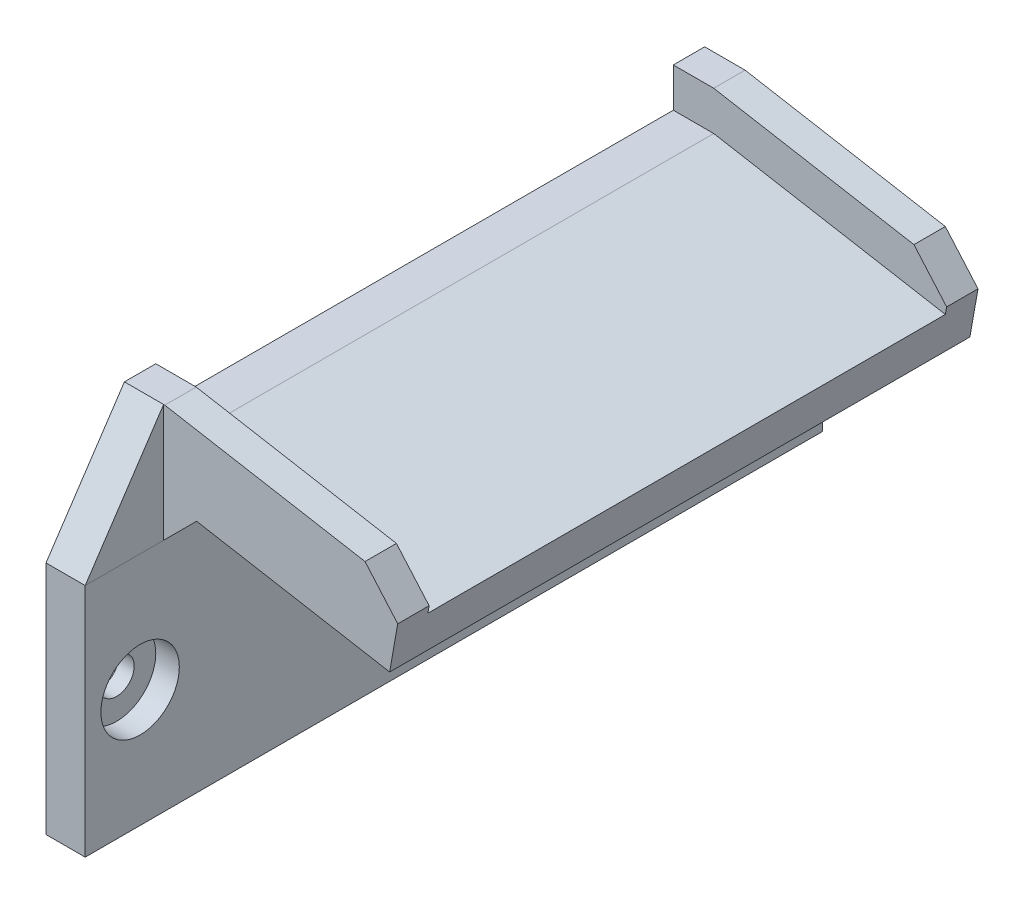
ISO-10303-21;
HEADER;
FILE_DESCRIPTION(('STEP AP214'),'2;1');
FILE_NAME('part.step','',(''),(''),'','','');
FILE_SCHEMA(('AUTOMOTIVE_DESIGN { 1 0 10303 214 1 1 1 1 }'));
ENDSEC;
DATA;
#1=APPLICATION_CONTEXT('core data for automotive mechanical design processes');
#2=APPLICATION_PROTOCOL_DEFINITION('international standard','automotive_design',2000,#1);
#3=PRODUCT_CONTEXT('',#1,'mechanical');
#4=PRODUCT('Part','Part','',(#3));
#5=PRODUCT_RELATED_PRODUCT_CATEGORY('part','',(#4));
#6=PRODUCT_DEFINITION_FORMATION('','',#4);
#7=PRODUCT_DEFINITION_CONTEXT('part definition',#1,'design');
#8=PRODUCT_DEFINITION('design','',#6,#7);
#9=PRODUCT_DEFINITION_SHAPE('','',#8);
#10=(LENGTH_UNIT() NAMED_UNIT(*) SI_UNIT(.MILLI.,.METRE.));
#11=(NAMED_UNIT(*) PLANE_ANGLE_UNIT() SI_UNIT($,.RADIAN.));
#12=(NAMED_UNIT(*) SI_UNIT($,.STERADIAN.) SOLID_ANGLE_UNIT());
#13=UNCERTAINTY_MEASURE_WITH_UNIT(LENGTH_MEASURE(1.E-05),#10,'distance_accuracy_value','');
#14=(GEOMETRIC_REPRESENTATION_CONTEXT(3) GLOBAL_UNCERTAINTY_ASSIGNED_CONTEXT((#13)) GLOBAL_UNIT_ASSIGNED_CONTEXT((#10,
#11,#12)) REPRESENTATION_CONTEXT('',''));
#15=CARTESIAN_POINT('',(0.,0.,0.));
#16=DIRECTION('',(0.,0.,1.));
#17=DIRECTION('',(1.,0.,0.));
#18=AXIS2_PLACEMENT_3D('',#15,#16,#17);
#19=CARTESIAN_POINT('',(5.,30.,80.));
#20=DIRECTION('',(0.,0.554700196225229,0.832050294337844));
#21=DIRECTION('',(0.,-0.832050294337844,0.554700196225229));
#22=AXIS2_PLACEMENT_3D('',#19,#20,#21);
#23=PLANE('',#22);
#24=DIRECTION('',(0.,0.832050294337844,-0.554700196225229));
#25=VECTOR('',#24,1.);
#26=CARTESIAN_POINT('',(0.,30.,80.));
#27=LINE('',#26,#25);
#28=CARTESIAN_POINT('',(0.,30.,80.));
#29=VERTEX_POINT('',#28);
#30=CARTESIAN_POINT('',(0.,45.,70.));
#31=VERTEX_POINT('',#30);
#32=EDGE_CURVE('E12',#29,#31,#27,.T.);
#33=ORIENTED_EDGE('',*,*,#32,.F.);
#34=DIRECTION('',(-1.,0.,0.));
#35=VECTOR('',#34,1.);
#36=CARTESIAN_POINT('',(5.,30.,80.));
#37=LINE('',#36,#35);
#38=CARTESIAN_POINT('',(5.,30.,80.));
#39=VERTEX_POINT('',#38);
#40=EDGE_CURVE('E89',#39,#29,#37,.T.);
#41=ORIENTED_EDGE('',*,*,#40,.F.);
#42=DIRECTION('',(0.,0.832050294337844,-0.554700196225229));
#43=VECTOR('',#42,1.);
#44=CARTESIAN_POINT('',(5.,30.,80.));
#45=LINE('',#44,#43);
#46=CARTESIAN_POINT('',(5.,45.,70.));
#47=VERTEX_POINT('',#46);
#48=EDGE_CURVE('E55',#39,#47,#45,.T.);
#49=ORIENTED_EDGE('',*,*,#48,.T.);
#50=DIRECTION('',(-1.,0.,0.));
#51=VECTOR('',#50,1.);
#52=CARTESIAN_POINT('',(5.,45.,70.));
#53=LINE('',#52,#51);
#54=EDGE_CURVE('E70',#47,#31,#53,.T.);
#55=ORIENTED_EDGE('',*,*,#54,.T.);
#56=EDGE_LOOP('',(#33,#41,#49,#55));
#57=FACE_BOUND('',#56,.T.);
#58=ADVANCED_FACE('F51',(#57),#23,.T.);
#59=CARTESIAN_POINT('',(5.,30.,70.));
#60=DIRECTION('',(0.,-1.,0.));
#61=DIRECTION('',(0.,0.,-1.));
#62=AXIS2_PLACEMENT_3D('',#59,#60,#61);
#63=PLANE('',#62);
#64=DIRECTION('',(0.,0.,1.));
#65=VECTOR('',#64,1.);
#66=CARTESIAN_POINT('',(0.,30.,70.));
#67=LINE('',#66,#65);
#68=CARTESIAN_POINT('',(0.,30.,70.));
#69=VERTEX_POINT('',#68);
#70=EDGE_CURVE('E92',#69,#29,#67,.T.);
#71=ORIENTED_EDGE('',*,*,#70,.F.);
#72=DIRECTION('',(-1.,0.,0.));
#73=VECTOR('',#72,1.);
#74=CARTESIAN_POINT('',(5.,30.,70.));
#75=LINE('',#74,#73);
#76=CARTESIAN_POINT('',(5.,30.,70.));
#77=VERTEX_POINT('',#76);
#78=EDGE_CURVE('E84',#77,#69,#75,.T.);
#79=ORIENTED_EDGE('',*,*,#78,.F.);
#80=DIRECTION('',(0.,0.,1.));
#81=VECTOR('',#80,1.);
#82=CARTESIAN_POINT('',(5.,30.,70.));
#83=LINE('',#82,#81);
#84=EDGE_CURVE('E94',#77,#39,#83,.T.);
#85=ORIENTED_EDGE('',*,*,#84,.T.);
#86=ORIENTED_EDGE('',*,*,#40,.T.);
#87=EDGE_LOOP('',(#71,#79,#85,#86));
#88=FACE_BOUND('',#87,.T.);
#89=ADVANCED_FACE('F90',(#88),#63,.T.);
#90=CARTESIAN_POINT('',(5.,45.,70.));
#91=DIRECTION('',(0.,0.,-1.));
#92=DIRECTION('',(-1.,0.,0.));
#93=AXIS2_PLACEMENT_3D('',#90,#91,#92);
#94=PLANE('',#93);
#95=DIRECTION('',(0.,-1.,0.));
#96=VECTOR('',#95,1.);
#97=CARTESIAN_POINT('',(0.,45.,70.));
#98=LINE('',#97,#96);
#99=EDGE_CURVE('E61',#31,#69,#98,.T.);
#100=ORIENTED_EDGE('',*,*,#99,.F.);
#101=ORIENTED_EDGE('',*,*,#54,.F.);
#102=DIRECTION('',(0.,-1.,0.));
#103=VECTOR('',#102,1.);
#104=CARTESIAN_POINT('',(5.,45.,70.));
#105=LINE('',#104,#103);
#106=EDGE_CURVE('E102',#47,#77,#105,.T.);
#107=ORIENTED_EDGE('',*,*,#106,.T.);
#108=ORIENTED_EDGE('',*,*,#78,.T.);
#109=EDGE_LOOP('',(#100,#101,#107,#108));
#110=FACE_BOUND('',#109,.T.);
#111=ADVANCED_FACE('F105',(#110),#94,.T.);
#112=CARTESIAN_POINT('',(5.,0.,0.));
#113=DIRECTION('',(1.,0.,0.));
#114=DIRECTION('',(0.,0.,-1.));
#115=AXIS2_PLACEMENT_3D('',#112,#113,#114);
#116=PLANE('',#115);
#117=ORIENTED_EDGE('',*,*,#48,.F.);
#118=ORIENTED_EDGE('',*,*,#84,.F.);
#119=ORIENTED_EDGE('',*,*,#106,.F.);
#120=EDGE_LOOP('',(#117,#118,#119));
#121=FACE_BOUND('',#120,.T.);
#122=ADVANCED_FACE('F53',(#121),#116,.T.);
#123=CARTESIAN_POINT('',(0.,0.,0.));
#124=DIRECTION('',(1.,0.,0.));
#125=DIRECTION('',(0.,0.,-1.));
#126=AXIS2_PLACEMENT_3D('',#123,#124,#125);
#127=PLANE('',#126);
#128=ORIENTED_EDGE('',*,*,#32,.T.);
#129=ORIENTED_EDGE('',*,*,#99,.T.);
#130=ORIENTED_EDGE('',*,*,#70,.T.);
#131=EDGE_LOOP('',(#128,#129,#130));
#132=FACE_BOUND('',#131,.T.);
#133=ADVANCED_FACE('F99',(#132),#127,.F.);
#134=CLOSED_SHELL('',(#58,#89,#111,#122,#133));
#135=MANIFOLD_SOLID_BREP('B2',#134);
#136=CARTESIAN_POINT('',(5.,30.,-4.));
#137=DIRECTION('',(0.,0.,1.));
#138=DIRECTION('',(1.,0.,0.));
#139=AXIS2_PLACEMENT_3D('',#136,#137,#138);
#140=PLANE('',#139);
#141=DIRECTION('',(0.,1.,0.));
#142=VECTOR('',#141,1.);
#143=CARTESIAN_POINT('',(0.,30.,-4.));
#144=LINE('',#143,#142);
#145=CARTESIAN_POINT('',(0.,30.,-4.));
#146=VERTEX_POINT('',#145);
#147=CARTESIAN_POINT('',(0.,45.,-4.));
#148=VERTEX_POINT('',#147);
#149=EDGE_CURVE('E219',#146,#148,#144,.T.);
#150=ORIENTED_EDGE('',*,*,#149,.F.);
#151=DIRECTION('',(-1.,0.,0.));
#152=VECTOR('',#151,1.);
#153=CARTESIAN_POINT('',(5.,30.,-4.));
#154=LINE('',#153,#152);
#155=CARTESIAN_POINT('',(5.,30.,-4.));
#156=VERTEX_POINT('',#155);
#157=EDGE_CURVE('E49',#156,#146,#154,.T.);
#158=ORIENTED_EDGE('',*,*,#157,.F.);
#159=DIRECTION('',(0.,1.,0.));
#160=VECTOR('',#159,1.);
#161=CARTESIAN_POINT('',(5.,30.,-4.));
#162=LINE('',#161,#160);
#163=CARTESIAN_POINT('',(5.,45.,-4.));
#164=VERTEX_POINT('',#163);
#165=EDGE_CURVE('E211',#156,#164,#162,.T.);
#166=ORIENTED_EDGE('',*,*,#165,.T.);
#167=DIRECTION('',(-1.,0.,0.));
#168=VECTOR('',#167,1.);
#169=CARTESIAN_POINT('',(5.,45.,-4.));
#170=LINE('',#169,#168);
#171=EDGE_CURVE('E170',#164,#148,#170,.T.);
#172=ORIENTED_EDGE('',*,*,#171,.T.);
#173=EDGE_LOOP('',(#150,#158,#166,#172));
#174=FACE_BOUND('',#173,.T.);
#175=ADVANCED_FACE('F167',(#174),#140,.T.);
#176=CARTESIAN_POINT('',(5.,30.,-14.));
#177=DIRECTION('',(0.,-1.,0.));
#178=DIRECTION('',(0.,0.,-1.));
#179=AXIS2_PLACEMENT_3D('',#176,#177,#178);
#180=PLANE('',#179);
#181=DIRECTION('',(0.,0.,1.));
#182=VECTOR('',#181,1.);
#183=CARTESIAN_POINT('',(0.,30.,-14.));
#184=LINE('',#183,#182);
#185=CARTESIAN_POINT('',(0.,30.,-14.));
#186=VERTEX_POINT('',#185);
#187=EDGE_CURVE('E213',#186,#146,#184,.T.);
#188=ORIENTED_EDGE('',*,*,#187,.F.);
#189=DIRECTION('',(-1.,0.,0.));
#190=VECTOR('',#189,1.);
#191=CARTESIAN_POINT('',(5.,30.,-14.));
#192=LINE('',#191,#190);
#193=CARTESIAN_POINT('',(5.,30.,-14.));
#194=VERTEX_POINT('',#193);
#195=EDGE_CURVE('E176',#194,#186,#192,.T.);
#196=ORIENTED_EDGE('',*,*,#195,.F.);
#197=DIRECTION('',(0.,0.,1.));
#198=VECTOR('',#197,1.);
#199=CARTESIAN_POINT('',(5.,30.,-14.));
#200=LINE('',#199,#198);
#201=EDGE_CURVE('E208',#194,#156,#200,.T.);
#202=ORIENTED_EDGE('',*,*,#201,.T.);
#203=ORIENTED_EDGE('',*,*,#157,.T.);
#204=EDGE_LOOP('',(#188,#196,#202,#203));
#205=FACE_BOUND('',#204,.T.);
#206=ADVANCED_FACE('F223',(#205),#180,.T.);
#207=CARTESIAN_POINT('',(5.,45.,-4.));
#208=DIRECTION('',(0.,0.554700196225229,-0.832050294337844));
#209=DIRECTION('',(0.,0.832050294337844,0.554700196225229));
#210=AXIS2_PLACEMENT_3D('',#207,#208,#209);
#211=PLANE('',#210);
#212=DIRECTION('',(0.,-0.832050294337844,-0.554700196225229));
#213=VECTOR('',#212,1.);
#214=CARTESIAN_POINT('',(0.,45.,-4.));
#215=LINE('',#214,#213);
#216=EDGE_CURVE('E206',#148,#186,#215,.T.);
#217=ORIENTED_EDGE('',*,*,#216,.F.);
#218=ORIENTED_EDGE('',*,*,#171,.F.);
#219=DIRECTION('',(0.,-0.832050294337844,-0.554700196225229));
#220=VECTOR('',#219,1.);
#221=CARTESIAN_POINT('',(5.,45.,-4.));
#222=LINE('',#221,#220);
#223=EDGE_CURVE('E204',#164,#194,#222,.T.);
#224=ORIENTED_EDGE('',*,*,#223,.T.);
#225=ORIENTED_EDGE('',*,*,#195,.T.);
#226=EDGE_LOOP('',(#217,#218,#224,#225));
#227=FACE_BOUND('',#226,.T.);
#228=ADVANCED_FACE('F203',(#227),#211,.T.);
#229=CARTESIAN_POINT('',(5.,0.,0.));
#230=DIRECTION('',(1.,0.,0.));
#231=DIRECTION('',(0.,0.,-1.));
#232=AXIS2_PLACEMENT_3D('',#229,#230,#231);
#233=PLANE('',#232);
#234=ORIENTED_EDGE('',*,*,#165,.F.);
#235=ORIENTED_EDGE('',*,*,#201,.F.);
#236=ORIENTED_EDGE('',*,*,#223,.F.);
#237=EDGE_LOOP('',(#234,#235,#236));
#238=FACE_BOUND('',#237,.T.);
#239=ADVANCED_FACE('F210',(#238),#233,.T.);
#240=CARTESIAN_POINT('',(0.,0.,0.));
#241=DIRECTION('',(1.,0.,0.));
#242=DIRECTION('',(0.,0.,-1.));
#243=AXIS2_PLACEMENT_3D('',#240,#241,#242);
#244=PLANE('',#243);
#245=ORIENTED_EDGE('',*,*,#149,.T.);
#246=ORIENTED_EDGE('',*,*,#216,.T.);
#247=ORIENTED_EDGE('',*,*,#187,.T.);
#248=EDGE_LOOP('',(#245,#246,#247));
#249=FACE_BOUND('',#248,.T.);
#250=ADVANCED_FACE('F222',(#249),#244,.F.);
#251=CLOSED_SHELL('',(#175,#206,#228,#239,#250));
#252=MANIFOLD_SOLID_BREP('B6',#251);
#253=CARTESIAN_POINT('',(5.,0.,66.));
#254=DIRECTION('',(0.,1.,0.));
#255=DIRECTION('',(0.,0.,1.));
#256=AXIS2_PLACEMENT_3D('',#253,#254,#255);
#257=PLANE('',#256);
#258=DIRECTION('',(0.,0.,-1.));
#259=VECTOR('',#258,1.);
#260=CARTESIAN_POINT('',(0.,0.,66.));
#261=LINE('',#260,#259);
#262=CARTESIAN_POINT('',(0.,0.,80.));
#263=VERTEX_POINT('',#262);
#264=CARTESIAN_POINT('',(0.,0.,-14.));
#265=VERTEX_POINT('',#264);
#266=EDGE_CURVE('E530',#263,#265,#261,.T.);
#267=ORIENTED_EDGE('',*,*,#266,.T.);
#268=DIRECTION('',(-1.,0.,0.));
#269=VECTOR('',#268,1.);
#270=CARTESIAN_POINT('',(5.,0.,-14.));
#271=LINE('',#270,#269);
#272=CARTESIAN_POINT('',(5.,0.,-14.));
#273=VERTEX_POINT('',#272);
#274=EDGE_CURVE('E411',#273,#265,#271,.T.);
#275=ORIENTED_EDGE('',*,*,#274,.F.);
#276=DIRECTION('',(0.,0.,-1.));
#277=VECTOR('',#276,1.);
#278=CARTESIAN_POINT('',(5.,0.,66.));
#279=LINE('',#278,#277);
#280=CARTESIAN_POINT('',(5.,0.,80.));
#281=VERTEX_POINT('',#280);
#282=EDGE_CURVE('E406',#281,#273,#279,.T.);
#283=ORIENTED_EDGE('',*,*,#282,.F.);
#284=DIRECTION('',(1.,0.,0.));
#285=VECTOR('',#284,1.);
#286=CARTESIAN_POINT('',(5.,0.,80.));
#287=LINE('',#286,#285);
#288=EDGE_CURVE('E409',#263,#281,#287,.T.);
#289=ORIENTED_EDGE('',*,*,#288,.F.);
#290=EDGE_LOOP('',(#267,#275,#283,#289));
#291=FACE_BOUND('',#290,.T.);
#292=ADVANCED_FACE('F274',(#291),#257,.F.);
#293=CARTESIAN_POINT('',(5.,30.,66.));
#294=DIRECTION('',(-1.,0.,0.));
#295=DIRECTION('',(0.,-1.,0.));
#296=AXIS2_PLACEMENT_3D('',#293,#294,#295);
#297=PLANE('',#296);
#298=CARTESIAN_POINT('',(5.,15.,73.));
#299=DIRECTION('',(1.,0.,0.));
#300=DIRECTION('',(0.,0.,-1.));
#301=AXIS2_PLACEMENT_3D('',#298,#299,#300);
#302=CIRCLE('',#301,4.99999999999999);
#303=CARTESIAN_POINT('',(5.,15.,68.));
#304=VERTEX_POINT('',#303);
#305=EDGE_CURVE('E718',#304,#304,#302,.T.);
#306=ORIENTED_EDGE('',*,*,#305,.F.);
#307=EDGE_LOOP('',(#306));
#308=FACE_BOUND('',#307,.T.);
#309=CARTESIAN_POINT('',(5.,15.,-7.00000000000001));
#310=DIRECTION('',(1.,0.,0.));
#311=DIRECTION('',(0.,0.,-1.));
#312=AXIS2_PLACEMENT_3D('',#309,#310,#311);
#313=CIRCLE('',#312,4.99999999999999);
#314=CARTESIAN_POINT('',(5.,15.,-12.));
#315=VERTEX_POINT('',#314);
#316=EDGE_CURVE('E557',#315,#315,#313,.T.);
#317=ORIENTED_EDGE('',*,*,#316,.F.);
#318=EDGE_LOOP('',(#317));
#319=FACE_BOUND('',#318,.T.);
#320=ORIENTED_EDGE('',*,*,#282,.T.);
#321=DIRECTION('',(0.,-1.,0.));
#322=VECTOR('',#321,1.);
#323=CARTESIAN_POINT('',(5.,30.,-14.));
#324=LINE('',#323,#322);
#325=CARTESIAN_POINT('',(5.,30.,-14.));
#326=VERTEX_POINT('',#325);
#327=EDGE_CURVE('E448',#326,#273,#324,.T.);
#328=ORIENTED_EDGE('',*,*,#327,.F.);
#329=DIRECTION('',(0.,0.,1.));
#330=VECTOR('',#329,1.);
#331=CARTESIAN_POINT('',(5.,30.,-14.));
#332=LINE('',#331,#330);
#333=CARTESIAN_POINT('',(5.,30.,-4.));
#334=VERTEX_POINT('',#333);
#335=EDGE_CURVE('E455',#326,#334,#332,.T.);
#336=ORIENTED_EDGE('',*,*,#335,.T.);
#337=DIRECTION('',(0.,0.,-1.));
#338=VECTOR('',#337,1.);
#339=CARTESIAN_POINT('',(5.,30.,66.));
#340=LINE('',#339,#338);
#341=CARTESIAN_POINT('',(4.99999999999999,30.,70.));
#342=VERTEX_POINT('',#341);
#343=EDGE_CURVE('E416',#342,#334,#340,.T.);
#344=ORIENTED_EDGE('',*,*,#343,.F.);
#345=DIRECTION('',(0.,0.,-1.));
#346=VECTOR('',#345,1.);
#347=CARTESIAN_POINT('',(4.99999999999999,30.,80.));
#348=LINE('',#347,#346);
#349=CARTESIAN_POINT('',(4.99999999999999,30.,80.));
#350=VERTEX_POINT('',#349);
#351=EDGE_CURVE('E423',#350,#342,#348,.T.);
#352=ORIENTED_EDGE('',*,*,#351,.F.);
#353=DIRECTION('',(0.,1.,0.));
#354=VECTOR('',#353,1.);
#355=CARTESIAN_POINT('',(4.99999999999999,30.,80.));
#356=LINE('',#355,#354);
#357=EDGE_CURVE('E419',#281,#350,#356,.T.);
#358=ORIENTED_EDGE('',*,*,#357,.F.);
#359=EDGE_LOOP('',(#320,#328,#336,#344,#352,#358));
#360=FACE_BOUND('',#359,.T.);
#361=ADVANCED_FACE('F420',(#308,#319,#360),#297,.F.);
#362=CARTESIAN_POINT('',(9.20772034660431,34.2077203466043,66.));
#363=DIRECTION('',(-0.707106781186546,0.707106781186549,0.));
#364=DIRECTION('',(-0.707106781186549,-0.707106781186546,0.));
#365=AXIS2_PLACEMENT_3D('',#362,#363,#364);
#366=PLANE('',#365);
#367=ORIENTED_EDGE('',*,*,#343,.T.);
#368=DIRECTION('',(-0.707106781186549,-0.707106781186546,0.));
#369=VECTOR('',#368,1.);
#370=CARTESIAN_POINT('',(9.20772034660431,34.2077203466043,-4.));
#371=LINE('',#370,#369);
#372=CARTESIAN_POINT('',(9.20772034660431,34.2077203466043,-4.));
#373=VERTEX_POINT('',#372);
#374=EDGE_CURVE('E476',#373,#334,#371,.T.);
#375=ORIENTED_EDGE('',*,*,#374,.F.);
#376=DIRECTION('',(0.,0.,-1.));
#377=VECTOR('',#376,1.);
#378=CARTESIAN_POINT('',(9.20772034660431,34.2077203466043,66.));
#379=LINE('',#378,#377);
#380=CARTESIAN_POINT('',(9.20772034660431,34.2077203466043,70.));
#381=VERTEX_POINT('',#380);
#382=EDGE_CURVE('E548',#381,#373,#379,.T.);
#383=ORIENTED_EDGE('',*,*,#382,.F.);
#384=DIRECTION('',(0.707106781186549,0.707106781186546,0.));
#385=VECTOR('',#384,1.);
#386=CARTESIAN_POINT('',(-12.5,12.5000000000001,70.));
#387=LINE('',#386,#385);
#388=EDGE_CURVE('E493',#342,#381,#387,.T.);
#389=ORIENTED_EDGE('',*,*,#388,.F.);
#390=EDGE_LOOP('',(#367,#375,#383,#389));
#391=FACE_BOUND('',#390,.T.);
#392=ADVANCED_FACE('F635',(#391),#366,.F.);
#393=CARTESIAN_POINT('',(33.8279141719095,29.866515904931,66.));
#394=DIRECTION('',(0.173648177666931,0.984807753012208,0.));
#395=DIRECTION('',(-0.984807753012208,0.173648177666931,0.));
#396=AXIS2_PLACEMENT_3D('',#393,#394,#395);
#397=PLANE('',#396);
#398=ORIENTED_EDGE('',*,*,#382,.T.);
#399=DIRECTION('',(-0.984807753012208,0.173648177666931,0.));
#400=VECTOR('',#399,1.);
#401=CARTESIAN_POINT('',(33.8279141719095,29.866515904931,-4.));
#402=LINE('',#401,#400);
#403=CARTESIAN_POINT('',(33.8279141719095,29.866515904931,-4.));
#404=VERTEX_POINT('',#403);
#405=EDGE_CURVE('E473',#404,#373,#402,.T.);
#406=ORIENTED_EDGE('',*,*,#405,.F.);
#407=DIRECTION('',(0.,0.,-1.));
#408=VECTOR('',#407,1.);
#409=CARTESIAN_POINT('',(33.8279141719095,29.866515904931,66.));
#410=LINE('',#409,#408);
#411=CARTESIAN_POINT('',(33.8279141719095,29.866515904931,70.));
#412=VERTEX_POINT('',#411);
#413=EDGE_CURVE('E545',#412,#404,#410,.T.);
#414=ORIENTED_EDGE('',*,*,#413,.F.);
#415=DIRECTION('',(0.984807753012208,-0.173648177666931,0.));
#416=VECTOR('',#415,1.);
#417=CARTESIAN_POINT('',(6.12751144921501,34.7508442814323,70.));
#418=LINE('',#417,#416);
#419=EDGE_CURVE('E497',#381,#412,#418,.T.);
#420=ORIENTED_EDGE('',*,*,#419,.F.);
#421=EDGE_LOOP('',(#398,#406,#414,#420));
#422=FACE_BOUND('',#421,.T.);
#423=ADVANCED_FACE('F646',(#422),#397,.F.);
#424=CARTESIAN_POINT('',(34.6961550602442,34.7905546699921,66.));
#425=DIRECTION('',(-0.984807753012208,0.173648177666933,0.));
#426=DIRECTION('',(-0.173648177666933,-0.984807753012208,0.));
#427=AXIS2_PLACEMENT_3D('',#424,#425,#426);
#428=PLANE('',#427);
#429=DIRECTION('',(-0.173648177666931,-0.984807753012208,0.));
#430=VECTOR('',#429,1.);
#431=CARTESIAN_POINT('',(35.5512054185583,39.6397862219568,-4.));
#432=LINE('',#431,#430);
#433=CARTESIAN_POINT('',(34.8566127078906,35.700555209908,-4.));
#434=VERTEX_POINT('',#433);
#435=EDGE_CURVE('E471',#434,#404,#432,.T.);
#436=ORIENTED_EDGE('',*,*,#435,.F.);
#437=DIRECTION('',(0.,0.,1.));
#438=VECTOR('',#437,1.);
#439=CARTESIAN_POINT('',(34.8566127078906,35.700555209908,66.));
#440=LINE('',#439,#438);
#441=CARTESIAN_POINT('',(34.8566127078906,35.700555209908,0.));
#442=VERTEX_POINT('',#441);
#443=EDGE_CURVE('E567',#434,#442,#440,.T.);
#444=ORIENTED_EDGE('',*,*,#443,.T.);
#445=DIRECTION('',(-0.173648177666931,-0.984807753012208,0.));
#446=VECTOR('',#445,1.);
#447=CARTESIAN_POINT('',(35.5512054185583,39.6397862219568,0.));
#448=LINE('',#447,#446);
#449=CARTESIAN_POINT('',(34.6961550602442,34.7905546699921,0.));
#450=VERTEX_POINT('',#449);
#451=EDGE_CURVE('E467',#442,#450,#448,.T.);
#452=ORIENTED_EDGE('',*,*,#451,.T.);
#453=DIRECTION('',(0.,0.,-1.));
#454=VECTOR('',#453,1.);
#455=CARTESIAN_POINT('',(34.6961550602442,34.7905546699921,66.));
#456=LINE('',#455,#454);
#457=CARTESIAN_POINT('',(34.6961550602442,34.7905546699921,66.));
#458=VERTEX_POINT('',#457);
#459=EDGE_CURVE('E542',#458,#450,#456,.T.);
#460=ORIENTED_EDGE('',*,*,#459,.F.);
#461=DIRECTION('',(0.173648177666933,0.984807753012208,0.));
#462=VECTOR('',#461,1.);
#463=CARTESIAN_POINT('',(27.7004027226944,-4.88432837650132,66.));
#464=LINE('',#463,#462);
#465=CARTESIAN_POINT('',(34.8566127078906,35.700555209908,66.));
#466=VERTEX_POINT('',#465);
#467=EDGE_CURVE('E511',#458,#466,#464,.T.);
#468=ORIENTED_EDGE('',*,*,#467,.T.);
#469=DIRECTION('',(0.,0.,1.));
#470=VECTOR('',#469,1.);
#471=CARTESIAN_POINT('',(34.8566127078906,35.700555209908,70.));
#472=LINE('',#471,#470);
#473=CARTESIAN_POINT('',(34.8566127078906,35.700555209908,70.));
#474=VERTEX_POINT('',#473);
#475=EDGE_CURVE('E563',#466,#474,#472,.T.);
#476=ORIENTED_EDGE('',*,*,#475,.T.);
#477=DIRECTION('',(0.173648177666933,0.984807753012208,0.));
#478=VECTOR('',#477,1.);
#479=CARTESIAN_POINT('',(27.7004027226944,-4.88432837650132,70.));
#480=LINE('',#479,#478);
#481=EDGE_CURVE('E500',#412,#474,#480,.T.);
#482=ORIENTED_EDGE('',*,*,#481,.F.);
#483=ORIENTED_EDGE('',*,*,#413,.T.);
#484=EDGE_LOOP('',(#436,#444,#452,#460,#468,#476,#482,#483));
#485=FACE_BOUND('',#484,.T.);
#486=ADVANCED_FACE('F573',(#485),#428,.F.);
#487=CARTESIAN_POINT('',(5.15192246987794,40.,66.));
#488=DIRECTION('',(-0.173648177666931,-0.984807753012208,0.));
#489=DIRECTION('',(0.984807753012208,-0.173648177666931,0.));
#490=AXIS2_PLACEMENT_3D('',#487,#488,#489);
#491=PLANE('',#490);
#492=DIRECTION('',(-0.984807753012208,0.173648177666931,0.));
#493=VECTOR('',#492,1.);
#494=CARTESIAN_POINT('',(5.15192246987794,40.,0.));
#495=LINE('',#494,#493);
#496=CARTESIAN_POINT('',(5.15192246987794,40.,0.));
#497=VERTEX_POINT('',#496);
#498=EDGE_CURVE('E522',#450,#497,#495,.T.);
#499=ORIENTED_EDGE('',*,*,#498,.T.);
#500=DIRECTION('',(0.,0.,-1.));
#501=VECTOR('',#500,1.);
#502=CARTESIAN_POINT('',(5.15192246987794,40.,66.));
#503=LINE('',#502,#501);
#504=CARTESIAN_POINT('',(5.15192246987794,40.,66.));
#505=VERTEX_POINT('',#504);
#506=EDGE_CURVE('E539',#505,#497,#503,.T.);
#507=ORIENTED_EDGE('',*,*,#506,.F.);
#508=DIRECTION('',(-0.984807753012208,0.173648177666931,0.));
#509=VECTOR('',#508,1.);
#510=CARTESIAN_POINT('',(5.15192246987794,40.,66.));
#511=LINE('',#510,#509);
#512=EDGE_CURVE('E523',#458,#505,#511,.T.);
#513=ORIENTED_EDGE('',*,*,#512,.F.);
#514=ORIENTED_EDGE('',*,*,#459,.T.);
#515=EDGE_LOOP('',(#499,#507,#513,#514));
#516=FACE_BOUND('',#515,.T.);
#517=ADVANCED_FACE('F580',(#516),#491,.F.);
#518=CARTESIAN_POINT('',(0.,40.,66.));
#519=DIRECTION('',(0.,-1.,0.));
#520=DIRECTION('',(0.,0.,-1.));
#521=AXIS2_PLACEMENT_3D('',#518,#519,#520);
#522=PLANE('',#521);
#523=DIRECTION('',(-1.,0.,0.));
#524=VECTOR('',#523,1.);
#525=CARTESIAN_POINT('',(0.,40.,0.));
#526=LINE('',#525,#524);
#527=CARTESIAN_POINT('',(0.,40.,0.));
#528=VERTEX_POINT('',#527);
#529=EDGE_CURVE('E527',#497,#528,#526,.T.);
#530=ORIENTED_EDGE('',*,*,#529,.T.);
#531=DIRECTION('',(0.,0.,-1.));
#532=VECTOR('',#531,1.);
#533=CARTESIAN_POINT('',(0.,40.,66.));
#534=LINE('',#533,#532);
#535=CARTESIAN_POINT('',(0.,40.,66.));
#536=VERTEX_POINT('',#535);
#537=EDGE_CURVE('E536',#536,#528,#534,.T.);
#538=ORIENTED_EDGE('',*,*,#537,.F.);
#539=DIRECTION('',(-1.,0.,0.));
#540=VECTOR('',#539,1.);
#541=CARTESIAN_POINT('',(0.,40.,66.));
#542=LINE('',#541,#540);
#543=EDGE_CURVE('E526',#505,#536,#542,.T.);
#544=ORIENTED_EDGE('',*,*,#543,.F.);
#545=ORIENTED_EDGE('',*,*,#506,.T.);
#546=EDGE_LOOP('',(#530,#538,#544,#545));
#547=FACE_BOUND('',#546,.T.);
#548=ADVANCED_FACE('F655',(#547),#522,.F.);
#549=CARTESIAN_POINT('',(0.,0.,66.));
#550=DIRECTION('',(1.,0.,0.));
#551=DIRECTION('',(0.,0.,-1.));
#552=AXIS2_PLACEMENT_3D('',#549,#550,#551);
#553=PLANE('',#552);
#554=CARTESIAN_POINT('',(0.,15.,73.));
#555=DIRECTION('',(1.,0.,0.));
#556=DIRECTION('',(0.,0.,-1.));
#557=AXIS2_PLACEMENT_3D('',#554,#555,#556);
#558=CIRCLE('',#557,2.24999999999999);
#559=CARTESIAN_POINT('',(0.,15.,70.75));
#560=VERTEX_POINT('',#559);
#561=EDGE_CURVE('E554',#560,#560,#558,.T.);
#562=ORIENTED_EDGE('',*,*,#561,.T.);
#563=EDGE_LOOP('',(#562));
#564=FACE_BOUND('',#563,.T.);
#565=CARTESIAN_POINT('',(0.,15.,-7.00000000000001));
#566=DIRECTION('',(1.,0.,0.));
#567=DIRECTION('',(0.,0.,-1.));
#568=AXIS2_PLACEMENT_3D('',#565,#566,#567);
#569=CIRCLE('',#568,2.24999999999999);
#570=CARTESIAN_POINT('',(0.,15.,-9.25));
#571=VERTEX_POINT('',#570);
#572=EDGE_CURVE('E435',#571,#571,#569,.T.);
#573=ORIENTED_EDGE('',*,*,#572,.T.);
#574=EDGE_LOOP('',(#573));
#575=FACE_BOUND('',#574,.T.);
#576=ORIENTED_EDGE('',*,*,#537,.T.);
#577=DIRECTION('',(0.,1.,0.));
#578=VECTOR('',#577,1.);
#579=CARTESIAN_POINT('',(0.,0.,0.));
#580=LINE('',#579,#578);
#581=CARTESIAN_POINT('',(0.,45.,0.));
#582=VERTEX_POINT('',#581);
#583=EDGE_CURVE('E463',#528,#582,#580,.T.);
#584=ORIENTED_EDGE('',*,*,#583,.T.);
#585=DIRECTION('',(0.,0.,1.));
#586=VECTOR('',#585,1.);
#587=CARTESIAN_POINT('',(0.,45.,-4.));
#588=LINE('',#587,#586);
#589=CARTESIAN_POINT('',(0.,45.,-4.));
#590=VERTEX_POINT('',#589);
#591=EDGE_CURVE('E487',#590,#582,#588,.T.);
#592=ORIENTED_EDGE('',*,*,#591,.F.);
#593=DIRECTION('',(0.,1.,0.));
#594=VECTOR('',#593,1.);
#595=CARTESIAN_POINT('',(0.,0.,-4.));
#596=LINE('',#595,#594);
#597=CARTESIAN_POINT('',(0.,30.,-4.));
#598=VERTEX_POINT('',#597);
#599=EDGE_CURVE('E464',#598,#590,#596,.T.);
#600=ORIENTED_EDGE('',*,*,#599,.F.);
#601=DIRECTION('',(0.,0.,1.));
#602=VECTOR('',#601,1.);
#603=CARTESIAN_POINT('',(0.,30.,-14.));
#604=LINE('',#603,#602);
#605=CARTESIAN_POINT('',(0.,30.,-14.));
#606=VERTEX_POINT('',#605);
#607=EDGE_CURVE('E460',#606,#598,#604,.T.);
#608=ORIENTED_EDGE('',*,*,#607,.F.);
#609=DIRECTION('',(0.,1.,0.));
#610=VECTOR('',#609,1.);
#611=CARTESIAN_POINT('',(0.,0.,-14.));
#612=LINE('',#611,#610);
#613=EDGE_CURVE('E451',#265,#606,#612,.T.);
#614=ORIENTED_EDGE('',*,*,#613,.F.);
#615=ORIENTED_EDGE('',*,*,#266,.F.);
#616=DIRECTION('',(0.,-1.,0.));
#617=VECTOR('',#616,1.);
#618=CARTESIAN_POINT('',(0.,0.,80.));
#619=LINE('',#618,#617);
#620=CARTESIAN_POINT('',(0.,30.,80.));
#621=VERTEX_POINT('',#620);
#622=EDGE_CURVE('E431',#621,#263,#619,.T.);
#623=ORIENTED_EDGE('',*,*,#622,.F.);
#624=DIRECTION('',(0.,0.,-1.));
#625=VECTOR('',#624,1.);
#626=CARTESIAN_POINT('',(0.,30.,80.));
#627=LINE('',#626,#625);
#628=CARTESIAN_POINT('',(0.,30.,70.));
#629=VERTEX_POINT('',#628);
#630=EDGE_CURVE('E442',#621,#629,#627,.T.);
#631=ORIENTED_EDGE('',*,*,#630,.T.);
#632=DIRECTION('',(0.,-1.,0.));
#633=VECTOR('',#632,1.);
#634=CARTESIAN_POINT('',(0.,0.,70.));
#635=LINE('',#634,#633);
#636=CARTESIAN_POINT('',(0.,45.,70.));
#637=VERTEX_POINT('',#636);
#638=EDGE_CURVE('E491',#637,#629,#635,.T.);
#639=ORIENTED_EDGE('',*,*,#638,.F.);
#640=DIRECTION('',(0.,0.,-1.));
#641=VECTOR('',#640,1.);
#642=CARTESIAN_POINT('',(0.,45.,70.));
#643=LINE('',#642,#641);
#644=CARTESIAN_POINT('',(0.,45.,66.));
#645=VERTEX_POINT('',#644);
#646=EDGE_CURVE('E508',#637,#645,#643,.T.);
#647=ORIENTED_EDGE('',*,*,#646,.T.);
#648=DIRECTION('',(0.,-1.,0.));
#649=VECTOR('',#648,1.);
#650=CARTESIAN_POINT('',(0.,0.,66.));
#651=LINE('',#650,#649);
#652=EDGE_CURVE('E490',#645,#536,#651,.T.);
#653=ORIENTED_EDGE('',*,*,#652,.T.);
#654=EDGE_LOOP('',(#576,#584,#592,#600,#608,#614,#615,#623,#631,#639,#647,#653));
#655=FACE_BOUND('',#654,.T.);
#656=ADVANCED_FACE('F605',(#564,#575,#655),#553,.F.);
#657=CARTESIAN_POINT('',(0.,0.,66.));
#658=DIRECTION('',(0.,0.,1.));
#659=DIRECTION('',(1.,0.,0.));
#660=AXIS2_PLACEMENT_3D('',#657,#658,#659);
#661=PLANE('',#660);
#662=DIRECTION('',(0.984807753012208,-0.173648177666931,0.));
#663=VECTOR('',#662,1.);
#664=CARTESIAN_POINT('',(7.85080269586385,44.5241145984581,66.));
#665=LINE('',#664,#663);
#666=CARTESIAN_POINT('',(5.15192246987794,45.,66.));
#667=VERTEX_POINT('',#666);
#668=CARTESIAN_POINT('',(30.6866602428446,40.4975367853104,66.));
#669=VERTEX_POINT('',#668);
#670=EDGE_CURVE('E514',#667,#669,#665,.T.);
#671=ORIENTED_EDGE('',*,*,#670,.T.);
#672=DIRECTION('',(0.656059028990506,-0.754709580222773,0.));
#673=VECTOR('',#672,1.);
#674=CARTESIAN_POINT('',(30.6866602428446,40.4975367853104,66.));
#675=LINE('',#674,#673);
#676=EDGE_CURVE('E561',#669,#466,#675,.T.);
#677=ORIENTED_EDGE('',*,*,#676,.T.);
#678=ORIENTED_EDGE('',*,*,#467,.F.);
#679=ORIENTED_EDGE('',*,*,#512,.T.);
#680=ORIENTED_EDGE('',*,*,#543,.T.);
#681=ORIENTED_EDGE('',*,*,#652,.F.);
#682=DIRECTION('',(-1.,0.,0.));
#683=VECTOR('',#682,1.);
#684=CARTESIAN_POINT('',(0.,45.,66.));
#685=LINE('',#684,#683);
#686=EDGE_CURVE('E494',#667,#645,#685,.T.);
#687=ORIENTED_EDGE('',*,*,#686,.F.);
#688=EDGE_LOOP('',(#671,#677,#678,#679,#680,#681,#687));
#689=FACE_BOUND('',#688,.T.);
#690=ADVANCED_FACE('F661',(#689),#661,.F.);
#691=CARTESIAN_POINT('',(7.85080269586385,44.5241145984581,70.));
#692=DIRECTION('',(0.173648177666931,0.984807753012208,0.));
#693=DIRECTION('',(-0.984807753012208,0.173648177666931,0.));
#694=AXIS2_PLACEMENT_3D('',#691,#692,#693);
#695=PLANE('',#694);
#696=DIRECTION('',(0.984807753012208,-0.173648177666931,0.));
#697=VECTOR('',#696,1.);
#698=CARTESIAN_POINT('',(7.85080269586385,44.5241145984581,70.));
#699=LINE('',#698,#697);
#700=CARTESIAN_POINT('',(5.15192246987794,45.,70.));
#701=VERTEX_POINT('',#700);
#702=CARTESIAN_POINT('',(30.6866602428446,40.4975367853104,70.));
#703=VERTEX_POINT('',#702);
#704=EDGE_CURVE('E503',#701,#703,#699,.T.);
#705=ORIENTED_EDGE('',*,*,#704,.T.);
#706=DIRECTION('',(0.,0.,-1.));
#707=VECTOR('',#706,1.);
#708=CARTESIAN_POINT('',(30.6866602428446,40.4975367853104,66.));
#709=LINE('',#708,#707);
#710=EDGE_CURVE('E415',#703,#669,#709,.T.);
#711=ORIENTED_EDGE('',*,*,#710,.T.);
#712=ORIENTED_EDGE('',*,*,#670,.F.);
#713=DIRECTION('',(0.,0.,-1.));
#714=VECTOR('',#713,1.);
#715=CARTESIAN_POINT('',(5.15192246987794,45.,70.));
#716=LINE('',#715,#714);
#717=EDGE_CURVE('E520',#701,#667,#716,.T.);
#718=ORIENTED_EDGE('',*,*,#717,.F.);
#719=EDGE_LOOP('',(#705,#711,#712,#718));
#720=FACE_BOUND('',#719,.T.);
#721=ADVANCED_FACE('F593',(#720),#695,.T.);
#722=CARTESIAN_POINT('',(0.,45.,70.));
#723=DIRECTION('',(0.,-1.,0.));
#724=DIRECTION('',(0.,0.,-1.));
#725=AXIS2_PLACEMENT_3D('',#722,#723,#724);
#726=PLANE('',#725);
#727=ORIENTED_EDGE('',*,*,#686,.T.);
#728=ORIENTED_EDGE('',*,*,#646,.F.);
#729=DIRECTION('',(-1.,0.,0.));
#730=VECTOR('',#729,1.);
#731=CARTESIAN_POINT('',(0.,45.,70.));
#732=LINE('',#731,#730);
#733=EDGE_CURVE('E506',#701,#637,#732,.T.);
#734=ORIENTED_EDGE('',*,*,#733,.F.);
#735=ORIENTED_EDGE('',*,*,#717,.T.);
#736=EDGE_LOOP('',(#727,#728,#734,#735));
#737=FACE_BOUND('',#736,.T.);
#738=ADVANCED_FACE('F599',(#737),#726,.F.);
#739=CARTESIAN_POINT('',(0.,0.,70.));
#740=DIRECTION('',(0.,0.,1.));
#741=DIRECTION('',(1.,0.,0.));
#742=AXIS2_PLACEMENT_3D('',#739,#740,#741);
#743=PLANE('',#742);
#744=ORIENTED_EDGE('',*,*,#481,.T.);
#745=DIRECTION('',(-0.656059028990506,0.754709580222773,0.));
#746=VECTOR('',#745,1.);
#747=CARTESIAN_POINT('',(37.5304177240647,32.6246943922323,70.));
#748=LINE('',#747,#746);
#749=EDGE_CURVE('E565',#474,#703,#748,.T.);
#750=ORIENTED_EDGE('',*,*,#749,.T.);
#751=ORIENTED_EDGE('',*,*,#704,.F.);
#752=ORIENTED_EDGE('',*,*,#733,.T.);
#753=ORIENTED_EDGE('',*,*,#638,.T.);
#754=DIRECTION('',(-1.,0.,0.));
#755=VECTOR('',#754,1.);
#756=CARTESIAN_POINT('',(0.,30.,70.));
#757=LINE('',#756,#755);
#758=EDGE_CURVE('E432',#342,#629,#757,.T.);
#759=ORIENTED_EDGE('',*,*,#758,.F.);
#760=ORIENTED_EDGE('',*,*,#388,.T.);
#761=ORIENTED_EDGE('',*,*,#419,.T.);
#762=EDGE_LOOP('',(#744,#750,#751,#752,#753,#759,#760,#761));
#763=FACE_BOUND('',#762,.T.);
#764=ADVANCED_FACE('F591',(#763),#743,.T.);
#765=CARTESIAN_POINT('',(0.,45.,-4.));
#766=DIRECTION('',(0.,-1.,0.));
#767=DIRECTION('',(0.,0.,-1.));
#768=AXIS2_PLACEMENT_3D('',#765,#766,#767);
#769=PLANE('',#768);
#770=DIRECTION('',(1.,0.,0.));
#771=VECTOR('',#770,1.);
#772=CARTESIAN_POINT('',(0.,45.,0.));
#773=LINE('',#772,#771);
#774=CARTESIAN_POINT('',(5.15192246987794,45.,0.));
#775=VERTEX_POINT('',#774);
#776=EDGE_CURVE('E480',#582,#775,#773,.T.);
#777=ORIENTED_EDGE('',*,*,#776,.T.);
#778=DIRECTION('',(0.,0.,1.));
#779=VECTOR('',#778,1.);
#780=CARTESIAN_POINT('',(5.15192246987794,45.,-4.));
#781=LINE('',#780,#779);
#782=CARTESIAN_POINT('',(5.15192246987794,45.,-4.));
#783=VERTEX_POINT('',#782);
#784=EDGE_CURVE('E478',#783,#775,#781,.T.);
#785=ORIENTED_EDGE('',*,*,#784,.F.);
#786=DIRECTION('',(1.,0.,0.));
#787=VECTOR('',#786,1.);
#788=CARTESIAN_POINT('',(0.,45.,-4.));
#789=LINE('',#788,#787);
#790=EDGE_CURVE('E466',#590,#783,#789,.T.);
#791=ORIENTED_EDGE('',*,*,#790,.F.);
#792=ORIENTED_EDGE('',*,*,#591,.T.);
#793=EDGE_LOOP('',(#777,#785,#791,#792));
#794=FACE_BOUND('',#793,.T.);
#795=ADVANCED_FACE('F624',(#794),#769,.F.);
#796=CARTESIAN_POINT('',(5.15192246987794,45.,-4.));
#797=DIRECTION('',(-0.173648177666931,-0.984807753012208,0.));
#798=DIRECTION('',(0.984807753012208,-0.173648177666931,0.));
#799=AXIS2_PLACEMENT_3D('',#796,#797,#798);
#800=PLANE('',#799);
#801=DIRECTION('',(0.984807753012208,-0.173648177666931,0.));
#802=VECTOR('',#801,1.);
#803=CARTESIAN_POINT('',(5.15192246987794,45.,0.));
#804=LINE('',#803,#802);
#805=CARTESIAN_POINT('',(30.6866602428445,40.4975367853104,0.));
#806=VERTEX_POINT('',#805);
#807=EDGE_CURVE('E482',#775,#806,#804,.T.);
#808=ORIENTED_EDGE('',*,*,#807,.T.);
#809=DIRECTION('',(0.,0.,-1.));
#810=VECTOR('',#809,1.);
#811=CARTESIAN_POINT('',(30.6866602428445,40.4975367853104,-4.));
#812=LINE('',#811,#810);
#813=CARTESIAN_POINT('',(30.6866602428445,40.4975367853104,-4.));
#814=VERTEX_POINT('',#813);
#815=EDGE_CURVE('E283',#806,#814,#812,.T.);
#816=ORIENTED_EDGE('',*,*,#815,.T.);
#817=DIRECTION('',(0.984807753012208,-0.173648177666931,0.));
#818=VECTOR('',#817,1.);
#819=CARTESIAN_POINT('',(5.15192246987794,45.,-4.));
#820=LINE('',#819,#818);
#821=EDGE_CURVE('E469',#783,#814,#820,.T.);
#822=ORIENTED_EDGE('',*,*,#821,.F.);
#823=ORIENTED_EDGE('',*,*,#784,.T.);
#824=EDGE_LOOP('',(#808,#816,#822,#823));
#825=FACE_BOUND('',#824,.T.);
#826=ADVANCED_FACE('F673',(#825),#800,.F.);
#827=CARTESIAN_POINT('',(0.,0.,-4.));
#828=DIRECTION('',(0.,0.,-1.));
#829=DIRECTION('',(-1.,0.,0.));
#830=AXIS2_PLACEMENT_3D('',#827,#828,#829);
#831=PLANE('',#830);
#832=ORIENTED_EDGE('',*,*,#821,.T.);
#833=DIRECTION('',(-0.656059028990505,0.754709580222774,0.));
#834=VECTOR('',#833,1.);
#835=CARTESIAN_POINT('',(37.5304177240647,32.6246943922323,-4.));
#836=LINE('',#835,#834);
#837=EDGE_CURVE('E165',#814,#434,#836,.F.);
#838=ORIENTED_EDGE('',*,*,#837,.T.);
#839=ORIENTED_EDGE('',*,*,#435,.T.);
#840=ORIENTED_EDGE('',*,*,#405,.T.);
#841=ORIENTED_EDGE('',*,*,#374,.T.);
#842=DIRECTION('',(1.,0.,0.));
#843=VECTOR('',#842,1.);
#844=CARTESIAN_POINT('',(0.,30.,-4.));
#845=LINE('',#844,#843);
#846=EDGE_CURVE('E447',#598,#334,#845,.T.);
#847=ORIENTED_EDGE('',*,*,#846,.F.);
#848=ORIENTED_EDGE('',*,*,#599,.T.);
#849=ORIENTED_EDGE('',*,*,#790,.T.);
#850=EDGE_LOOP('',(#832,#838,#839,#840,#841,#847,#848,#849));
#851=FACE_BOUND('',#850,.T.);
#852=ADVANCED_FACE('F617',(#851),#831,.T.);
#853=CARTESIAN_POINT('',(0.,0.,0.));
#854=DIRECTION('',(0.,0.,-1.));
#855=DIRECTION('',(-1.,0.,0.));
#856=AXIS2_PLACEMENT_3D('',#853,#854,#855);
#857=PLANE('',#856);
#858=ORIENTED_EDGE('',*,*,#451,.F.);
#859=DIRECTION('',(0.656059028990505,-0.754709580222774,0.));
#860=VECTOR('',#859,1.);
#861=CARTESIAN_POINT('',(34.8566127078906,35.700555209908,0.));
#862=LINE('',#861,#860);
#863=EDGE_CURVE('E297',#442,#806,#862,.F.);
#864=ORIENTED_EDGE('',*,*,#863,.T.);
#865=ORIENTED_EDGE('',*,*,#807,.F.);
#866=ORIENTED_EDGE('',*,*,#776,.F.);
#867=ORIENTED_EDGE('',*,*,#583,.F.);
#868=ORIENTED_EDGE('',*,*,#529,.F.);
#869=ORIENTED_EDGE('',*,*,#498,.F.);
#870=EDGE_LOOP('',(#858,#864,#865,#866,#867,#868,#869));
#871=FACE_BOUND('',#870,.T.);
#872=ADVANCED_FACE('F577',(#871),#857,.F.);
#873=CARTESIAN_POINT('',(0.,30.,-14.));
#874=DIRECTION('',(0.,-1.,0.));
#875=DIRECTION('',(0.,0.,-1.));
#876=AXIS2_PLACEMENT_3D('',#873,#874,#875);
#877=PLANE('',#876);
#878=ORIENTED_EDGE('',*,*,#846,.T.);
#879=ORIENTED_EDGE('',*,*,#335,.F.);
#880=DIRECTION('',(1.,0.,0.));
#881=VECTOR('',#880,1.);
#882=CARTESIAN_POINT('',(0.,30.,-14.));
#883=LINE('',#882,#881);
#884=EDGE_CURVE('E453',#606,#326,#883,.T.);
#885=ORIENTED_EDGE('',*,*,#884,.F.);
#886=ORIENTED_EDGE('',*,*,#607,.T.);
#887=EDGE_LOOP('',(#878,#879,#885,#886));
#888=FACE_BOUND('',#887,.T.);
#889=ADVANCED_FACE('F614',(#888),#877,.F.);
#890=CARTESIAN_POINT('',(0.,0.,-14.));
#891=DIRECTION('',(0.,0.,-1.));
#892=DIRECTION('',(-1.,0.,0.));
#893=AXIS2_PLACEMENT_3D('',#890,#891,#892);
#894=PLANE('',#893);
#895=ORIENTED_EDGE('',*,*,#327,.T.);
#896=ORIENTED_EDGE('',*,*,#274,.T.);
#897=ORIENTED_EDGE('',*,*,#613,.T.);
#898=ORIENTED_EDGE('',*,*,#884,.T.);
#899=EDGE_LOOP('',(#895,#896,#897,#898));
#900=FACE_BOUND('',#899,.T.);
#901=ADVANCED_FACE('F609',(#900),#894,.T.);
#902=CARTESIAN_POINT('',(0.,30.,80.));
#903=DIRECTION('',(0.,-1.,0.));
#904=DIRECTION('',(0.,0.,-1.));
#905=AXIS2_PLACEMENT_3D('',#902,#903,#904);
#906=PLANE('',#905);
#907=ORIENTED_EDGE('',*,*,#758,.T.);
#908=ORIENTED_EDGE('',*,*,#630,.F.);
#909=DIRECTION('',(-1.,0.,0.));
#910=VECTOR('',#909,1.);
#911=CARTESIAN_POINT('',(0.,30.,80.));
#912=LINE('',#911,#910);
#913=EDGE_CURVE('E426',#350,#621,#912,.T.);
#914=ORIENTED_EDGE('',*,*,#913,.F.);
#915=ORIENTED_EDGE('',*,*,#351,.T.);
#916=EDGE_LOOP('',(#907,#908,#914,#915));
#917=FACE_BOUND('',#916,.T.);
#918=ADVANCED_FACE('F604',(#917),#906,.F.);
#919=CARTESIAN_POINT('',(0.,0.,80.));
#920=DIRECTION('',(0.,0.,-1.));
#921=DIRECTION('',(-1.,0.,0.));
#922=AXIS2_PLACEMENT_3D('',#919,#920,#921);
#923=PLANE('',#922);
#924=ORIENTED_EDGE('',*,*,#288,.T.);
#925=ORIENTED_EDGE('',*,*,#357,.T.);
#926=ORIENTED_EDGE('',*,*,#913,.T.);
#927=ORIENTED_EDGE('',*,*,#622,.T.);
#928=EDGE_LOOP('',(#924,#925,#926,#927));
#929=FACE_BOUND('',#928,.T.);
#930=ADVANCED_FACE('F429',(#929),#923,.F.);
#931=CARTESIAN_POINT('',(5.,15.,-7.00000000000001));
#932=DIRECTION('',(1.,0.,0.));
#933=DIRECTION('',(0.,0.,-1.));
#934=AXIS2_PLACEMENT_3D('',#931,#932,#933);
#935=CYLINDRICAL_SURFACE('',#934,2.24999999999999);
#936=CARTESIAN_POINT('',(2.,15.,-7.00000000000001));
#937=DIRECTION('',(1.,0.,0.));
#938=DIRECTION('',(0.,0.,-1.));
#939=AXIS2_PLACEMENT_3D('',#936,#937,#938);
#940=CIRCLE('',#939,2.25);
#941=CARTESIAN_POINT('',(2.,15.,-9.25));
#942=VERTEX_POINT('',#941);
#943=EDGE_CURVE('E438',#942,#942,#940,.T.);
#944=ORIENTED_EDGE('',*,*,#943,.T.);
#945=EDGE_LOOP('',(#944));
#946=FACE_BOUND('',#945,.T.);
#947=ORIENTED_EDGE('',*,*,#572,.F.);
#948=EDGE_LOOP('',(#947));
#949=FACE_BOUND('',#948,.T.);
#950=ADVANCED_FACE('F688',(#946,#949),#935,.F.);
#951=CARTESIAN_POINT('',(2.,17.25,-7.00000000000001));
#952=DIRECTION('',(-1.,0.,0.));
#953=DIRECTION('',(0.,0.,1.));
#954=AXIS2_PLACEMENT_3D('',#951,#952,#953);
#955=PLANE('',#954);
#956=ORIENTED_EDGE('',*,*,#943,.F.);
#957=EDGE_LOOP('',(#956));
#958=FACE_BOUND('',#957,.T.);
#959=CARTESIAN_POINT('',(2.,15.,-7.00000000000001));
#960=DIRECTION('',(1.,0.,0.));
#961=DIRECTION('',(0.,0.,-1.));
#962=AXIS2_PLACEMENT_3D('',#959,#960,#961);
#963=CIRCLE('',#962,4.99999999999999);
#964=CARTESIAN_POINT('',(2.,15.,-12.));
#965=VERTEX_POINT('',#964);
#966=EDGE_CURVE('E725',#965,#965,#963,.T.);
#967=ORIENTED_EDGE('',*,*,#966,.T.);
#968=EDGE_LOOP('',(#967));
#969=FACE_BOUND('',#968,.T.);
#970=ADVANCED_FACE('F691',(#958,#969),#955,.F.);
#971=CARTESIAN_POINT('',(5.,15.,-7.00000000000001));
#972=DIRECTION('',(1.,0.,0.));
#973=DIRECTION('',(0.,0.,-1.));
#974=AXIS2_PLACEMENT_3D('',#971,#972,#973);
#975=CYLINDRICAL_SURFACE('',#974,4.99999999999999);
#976=ORIENTED_EDGE('',*,*,#966,.F.);
#977=EDGE_LOOP('',(#976));
#978=FACE_BOUND('',#977,.T.);
#979=ORIENTED_EDGE('',*,*,#316,.T.);
#980=EDGE_LOOP('',(#979));
#981=FACE_BOUND('',#980,.T.);
#982=ADVANCED_FACE('F695',(#978,#981),#975,.F.);
#983=CARTESIAN_POINT('',(5.,15.,73.));
#984=DIRECTION('',(1.,0.,0.));
#985=DIRECTION('',(0.,0.,-1.));
#986=AXIS2_PLACEMENT_3D('',#983,#984,#985);
#987=CYLINDRICAL_SURFACE('',#986,2.24999999999999);
#988=CARTESIAN_POINT('',(2.,15.,73.));
#989=DIRECTION('',(1.,0.,0.));
#990=DIRECTION('',(0.,0.,-1.));
#991=AXIS2_PLACEMENT_3D('',#988,#989,#990);
#992=CIRCLE('',#991,2.25);
#993=CARTESIAN_POINT('',(2.,15.,70.75));
#994=VERTEX_POINT('',#993);
#995=EDGE_CURVE('E558',#994,#994,#992,.T.);
#996=ORIENTED_EDGE('',*,*,#995,.T.);
#997=EDGE_LOOP('',(#996));
#998=FACE_BOUND('',#997,.T.);
#999=ORIENTED_EDGE('',*,*,#561,.F.);
#1000=EDGE_LOOP('',(#999));
#1001=FACE_BOUND('',#1000,.T.);
#1002=ADVANCED_FACE('F699',(#998,#1001),#987,.F.);
#1003=CARTESIAN_POINT('',(2.,17.25,73.));
#1004=DIRECTION('',(-1.,0.,0.));
#1005=DIRECTION('',(0.,0.,1.));
#1006=AXIS2_PLACEMENT_3D('',#1003,#1004,#1005);
#1007=PLANE('',#1006);
#1008=ORIENTED_EDGE('',*,*,#995,.F.);
#1009=EDGE_LOOP('',(#1008));
#1010=FACE_BOUND('',#1009,.T.);
#1011=CARTESIAN_POINT('',(2.,15.,73.));
#1012=DIRECTION('',(1.,0.,0.));
#1013=DIRECTION('',(0.,0.,-1.));
#1014=AXIS2_PLACEMENT_3D('',#1011,#1012,#1013);
#1015=CIRCLE('',#1014,4.99999999999999);
#1016=CARTESIAN_POINT('',(2.,15.,68.));
#1017=VERTEX_POINT('',#1016);
#1018=EDGE_CURVE('E715',#1017,#1017,#1015,.T.);
#1019=ORIENTED_EDGE('',*,*,#1018,.T.);
#1020=EDGE_LOOP('',(#1019));
#1021=FACE_BOUND('',#1020,.T.);
#1022=ADVANCED_FACE('F703',(#1010,#1021),#1007,.F.);
#1023=CARTESIAN_POINT('',(5.,15.,73.));
#1024=DIRECTION('',(1.,0.,0.));
#1025=DIRECTION('',(0.,0.,-1.));
#1026=AXIS2_PLACEMENT_3D('',#1023,#1024,#1025);
#1027=CYLINDRICAL_SURFACE('',#1026,4.99999999999999);
#1028=ORIENTED_EDGE('',*,*,#1018,.F.);
#1029=EDGE_LOOP('',(#1028));
#1030=FACE_BOUND('',#1029,.T.);
#1031=ORIENTED_EDGE('',*,*,#305,.T.);
#1032=EDGE_LOOP('',(#1031));
#1033=FACE_BOUND('',#1032,.T.);
#1034=ADVANCED_FACE('F629',(#1030,#1033),#1027,.F.);
#1035=CARTESIAN_POINT('',(30.6866602428446,40.4975367853104,70.));
#1036=DIRECTION('',(0.754709580222773,0.656059028990506,0.));
#1037=DIRECTION('',(0.,0.,1.));
#1038=AXIS2_PLACEMENT_3D('',#1035,#1036,#1037);
#1039=PLANE('',#1038);
#1040=ORIENTED_EDGE('',*,*,#749,.F.);
#1041=ORIENTED_EDGE('',*,*,#475,.F.);
#1042=ORIENTED_EDGE('',*,*,#676,.F.);
#1043=ORIENTED_EDGE('',*,*,#710,.F.);
#1044=EDGE_LOOP('',(#1040,#1041,#1042,#1043));
#1045=FACE_BOUND('',#1044,.T.);
#1046=ADVANCED_FACE('F587',(#1045),#1039,.T.);
#1047=CARTESIAN_POINT('',(34.8566127078906,35.700555209908,66.));
#1048=DIRECTION('',(-0.754709580222774,-0.656059028990505,0.));
#1049=DIRECTION('',(0.,0.,1.));
#1050=AXIS2_PLACEMENT_3D('',#1047,#1048,#1049);
#1051=PLANE('',#1050);
#1052=ORIENTED_EDGE('',*,*,#837,.F.);
#1053=ORIENTED_EDGE('',*,*,#815,.F.);
#1054=ORIENTED_EDGE('',*,*,#863,.F.);
#1055=ORIENTED_EDGE('',*,*,#443,.F.);
#1056=EDGE_LOOP('',(#1052,#1053,#1054,#1055));
#1057=FACE_BOUND('',#1056,.T.);
#1058=ADVANCED_FACE('F277',(#1057),#1051,.F.);
#1059=CLOSED_SHELL('',(#292,#361,#392,#423,#486,#517,#548,#656,#690,#721,#738,#764,#795,#826,
#852,#872,#889,#901,#918,#930,#950,#970,#982,#1002,#1022,#1034,#1046,#1058));
#1060=MANIFOLD_SOLID_BREP('B43',#1059);
#1061=ADVANCED_BREP_SHAPE_REPRESENTATION('',(#18,#135,#252,#1060),#14);
#1062=SHAPE_DEFINITION_REPRESENTATION(#9,#1061);
ENDSEC;
END-ISO-10303-21;
